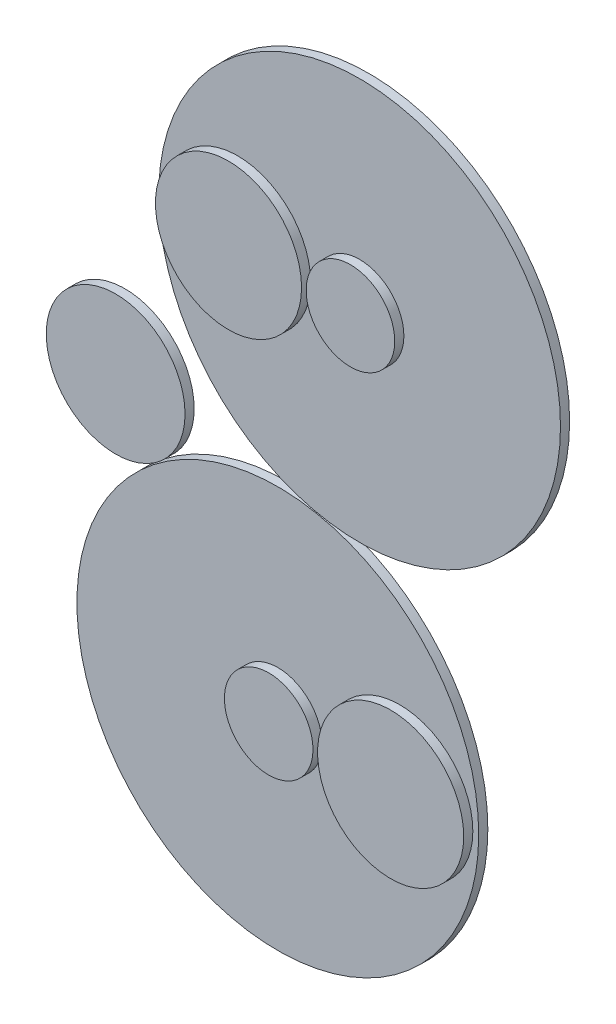
ISO-10303-21;
HEADER;
FILE_DESCRIPTION(('STEP AP214'),'2;1');
FILE_NAME('part.step','',(''),(''),'','','');
FILE_SCHEMA(('AUTOMOTIVE_DESIGN { 1 0 10303 214 1 1 1 1 }'));
ENDSEC;
DATA;
#1=APPLICATION_CONTEXT('core data for automotive mechanical design processes');
#2=APPLICATION_PROTOCOL_DEFINITION('international standard','automotive_design',2000,#1);
#3=PRODUCT_CONTEXT('',#1,'mechanical');
#4=PRODUCT('Part','Part','',(#3));
#5=PRODUCT_RELATED_PRODUCT_CATEGORY('part','',(#4));
#6=PRODUCT_DEFINITION_FORMATION('','',#4);
#7=PRODUCT_DEFINITION_CONTEXT('part definition',#1,'design');
#8=PRODUCT_DEFINITION('design','',#6,#7);
#9=PRODUCT_DEFINITION_SHAPE('','',#8);
#10=(LENGTH_UNIT() NAMED_UNIT(*) SI_UNIT(.MILLI.,.METRE.));
#11=(NAMED_UNIT(*) PLANE_ANGLE_UNIT() SI_UNIT($,.RADIAN.));
#12=(NAMED_UNIT(*) SI_UNIT($,.STERADIAN.) SOLID_ANGLE_UNIT());
#13=UNCERTAINTY_MEASURE_WITH_UNIT(LENGTH_MEASURE(1.E-05),#10,'distance_accuracy_value','');
#14=(GEOMETRIC_REPRESENTATION_CONTEXT(3) GLOBAL_UNCERTAINTY_ASSIGNED_CONTEXT((#13)) GLOBAL_UNIT_ASSIGNED_CONTEXT((#10,
#11,#12)) REPRESENTATION_CONTEXT('',''));
#15=CARTESIAN_POINT('',(0.,0.,0.));
#16=DIRECTION('',(0.,0.,1.));
#17=DIRECTION('',(1.,0.,0.));
#18=AXIS2_PLACEMENT_3D('',#15,#16,#17);
#19=CARTESIAN_POINT('',(-17.758926266195,23.8056828902649,1.));
#20=DIRECTION('',(0.,0.,-1.));
#21=DIRECTION('',(-1.,0.,0.));
#22=AXIS2_PLACEMENT_3D('',#19,#20,#21);
#23=CYLINDRICAL_SURFACE('',#22,7.6);
#24=CARTESIAN_POINT('',(-17.758926266195,23.8056828902649,1.));
#25=DIRECTION('',(0.,0.,1.));
#26=DIRECTION('',(1.,0.,0.));
#27=AXIS2_PLACEMENT_3D('',#24,#25,#26);
#28=CIRCLE('',#27,7.6);
#29=CARTESIAN_POINT('',(-10.158926266195,23.8056828902649,1.));
#30=VERTEX_POINT('',#29);
#31=EDGE_CURVE('E12',#30,#30,#28,.T.);
#32=ORIENTED_EDGE('',*,*,#31,.F.);
#33=EDGE_LOOP('',(#32));
#34=FACE_BOUND('',#33,.T.);
#35=CARTESIAN_POINT('',(-17.758926266195,23.8056828902649,0.));
#36=DIRECTION('',(0.,0.,1.));
#37=DIRECTION('',(1.,0.,0.));
#38=AXIS2_PLACEMENT_3D('',#35,#36,#37);
#39=CIRCLE('',#38,7.6);
#40=CARTESIAN_POINT('',(-10.158926266195,23.8056828902649,0.));
#41=VERTEX_POINT('',#40);
#42=EDGE_CURVE('E60',#41,#41,#39,.T.);
#43=ORIENTED_EDGE('',*,*,#42,.T.);
#44=EDGE_LOOP('',(#43));
#45=FACE_BOUND('',#44,.T.);
#46=ADVANCED_FACE('F57',(#34,#45),#23,.T.);
#47=CARTESIAN_POINT('',(4.47700000000001,-57.8908623119822,1.));
#48=DIRECTION('',(0.,0.,1.));
#49=DIRECTION('',(1.,0.,0.));
#50=AXIS2_PLACEMENT_3D('',#47,#48,#49);
#51=PLANE('',#50);
#52=ORIENTED_EDGE('',*,*,#31,.T.);
#53=EDGE_LOOP('',(#52));
#54=FACE_BOUND('',#53,.T.);
#55=ADVANCED_FACE('F72',(#54),#51,.T.);
#56=CARTESIAN_POINT('',(4.47700000000001,-57.8908623119822,0.));
#57=DIRECTION('',(0.,0.,1.));
#58=DIRECTION('',(1.,0.,0.));
#59=AXIS2_PLACEMENT_3D('',#56,#57,#58);
#60=PLANE('',#59);
#61=ORIENTED_EDGE('',*,*,#42,.F.);
#62=EDGE_LOOP('',(#61));
#63=FACE_BOUND('',#62,.T.);
#64=ADVANCED_FACE('F70',(#63),#60,.F.);
#65=CLOSED_SHELL('',(#46,#55,#64));
#66=MANIFOLD_SOLID_BREP('B2',#65);
#67=CARTESIAN_POINT('',(4.47700000000001,-57.8908623119822,1.));
#68=DIRECTION('',(0.,0.,1.));
#69=DIRECTION('',(1.,0.,0.));
#70=AXIS2_PLACEMENT_3D('',#67,#68,#69);
#71=PLANE('',#70);
#72=CARTESIAN_POINT('',(8.954,43.1814298512682,1.));
#73=DIRECTION('',(0.,0.,1.));
#74=DIRECTION('',(1.,0.,0.));
#75=AXIS2_PLACEMENT_3D('',#72,#73,#74);
#76=CIRCLE('',#75,4.85);
#77=CARTESIAN_POINT('',(13.804,43.1814298512682,1.));
#78=VERTEX_POINT('',#77);
#79=EDGE_CURVE('E117',#78,#78,#76,.T.);
#80=ORIENTED_EDGE('',*,*,#79,.F.);
#81=EDGE_LOOP('',(#80));
#82=FACE_BOUND('',#81,.T.);
#83=CARTESIAN_POINT('',(8.954,43.1814298512682,1.));
#84=DIRECTION('',(0.,0.,1.));
#85=DIRECTION('',(1.,0.,0.));
#86=AXIS2_PLACEMENT_3D('',#83,#84,#85);
#87=CIRCLE('',#86,22.);
#88=CARTESIAN_POINT('',(30.954,43.1814298512682,1.));
#89=VERTEX_POINT('',#88);
#90=EDGE_CURVE('E56',#89,#89,#87,.T.);
#91=ORIENTED_EDGE('',*,*,#90,.T.);
#92=EDGE_LOOP('',(#91));
#93=FACE_BOUND('',#92,.T.);
#94=CARTESIAN_POINT('',(-4.40099999999999,43.1814298512682,1.));
#95=DIRECTION('',(0.,0.,1.));
#96=DIRECTION('',(1.,0.,0.));
#97=AXIS2_PLACEMENT_3D('',#94,#95,#96);
#98=CIRCLE('',#97,8.);
#99=CARTESIAN_POINT('',(3.59900000000001,43.1814298512682,1.));
#100=VERTEX_POINT('',#99);
#101=EDGE_CURVE('E123',#100,#100,#98,.T.);
#102=ORIENTED_EDGE('',*,*,#101,.F.);
#103=EDGE_LOOP('',(#102));
#104=FACE_BOUND('',#103,.T.);
#105=ADVANCED_FACE('F104',(#82,#93,#104),#71,.T.);
#106=CARTESIAN_POINT('',(8.954,43.1814298512682,1.));
#107=DIRECTION('',(0.,0.,-1.));
#108=DIRECTION('',(-1.,0.,0.));
#109=AXIS2_PLACEMENT_3D('',#106,#107,#108);
#110=CYLINDRICAL_SURFACE('',#109,22.);
#111=ORIENTED_EDGE('',*,*,#90,.F.);
#112=EDGE_LOOP('',(#111));
#113=FACE_BOUND('',#112,.T.);
#114=CARTESIAN_POINT('',(8.954,43.1814298512682,0.));
#115=DIRECTION('',(0.,0.,1.));
#116=DIRECTION('',(1.,0.,0.));
#117=AXIS2_PLACEMENT_3D('',#114,#115,#116);
#118=CIRCLE('',#117,22.);
#119=CARTESIAN_POINT('',(30.954,43.1814298512682,0.));
#120=VERTEX_POINT('',#119);
#121=EDGE_CURVE('E108',#120,#120,#118,.T.);
#122=ORIENTED_EDGE('',*,*,#121,.T.);
#123=EDGE_LOOP('',(#122));
#124=FACE_BOUND('',#123,.T.);
#125=ADVANCED_FACE('F106',(#113,#124),#110,.T.);
#126=CARTESIAN_POINT('',(4.47700000000001,-57.8908623119822,0.));
#127=DIRECTION('',(0.,0.,1.));
#128=DIRECTION('',(1.,0.,0.));
#129=AXIS2_PLACEMENT_3D('',#126,#127,#128);
#130=PLANE('',#129);
#131=ORIENTED_EDGE('',*,*,#121,.F.);
#132=EDGE_LOOP('',(#131));
#133=FACE_BOUND('',#132,.T.);
#134=ADVANCED_FACE('F144',(#133),#130,.F.);
#135=CARTESIAN_POINT('',(8.954,43.1814298512682,2.));
#136=DIRECTION('',(0.,0.,-1.));
#137=DIRECTION('',(-1.,0.,0.));
#138=AXIS2_PLACEMENT_3D('',#135,#136,#137);
#139=CYLINDRICAL_SURFACE('',#138,4.85);
#140=CARTESIAN_POINT('',(8.954,43.1814298512682,2.));
#141=DIRECTION('',(0.,0.,1.));
#142=DIRECTION('',(1.,0.,0.));
#143=AXIS2_PLACEMENT_3D('',#140,#141,#142);
#144=CIRCLE('',#143,4.85);
#145=CARTESIAN_POINT('',(13.804,43.1814298512682,2.));
#146=VERTEX_POINT('',#145);
#147=EDGE_CURVE('E115',#146,#146,#144,.T.);
#148=ORIENTED_EDGE('',*,*,#147,.F.);
#149=EDGE_LOOP('',(#148));
#150=FACE_BOUND('',#149,.T.);
#151=ORIENTED_EDGE('',*,*,#79,.T.);
#152=EDGE_LOOP('',(#151));
#153=FACE_BOUND('',#152,.T.);
#154=ADVANCED_FACE('F148',(#150,#153),#139,.T.);
#155=CARTESIAN_POINT('',(8.954,43.1814298512682,2.));
#156=DIRECTION('',(0.,0.,1.));
#157=DIRECTION('',(1.,0.,0.));
#158=AXIS2_PLACEMENT_3D('',#155,#156,#157);
#159=PLANE('',#158);
#160=ORIENTED_EDGE('',*,*,#147,.T.);
#161=EDGE_LOOP('',(#160));
#162=FACE_BOUND('',#161,.T.);
#163=ADVANCED_FACE('F134',(#162),#159,.T.);
#164=CARTESIAN_POINT('',(-4.40099999999999,43.1814298512682,2.));
#165=DIRECTION('',(0.,0.,-1.));
#166=DIRECTION('',(-1.,0.,0.));
#167=AXIS2_PLACEMENT_3D('',#164,#165,#166);
#168=CYLINDRICAL_SURFACE('',#167,8.);
#169=CARTESIAN_POINT('',(-4.40099999999999,43.1814298512682,2.));
#170=DIRECTION('',(0.,0.,1.));
#171=DIRECTION('',(1.,0.,0.));
#172=AXIS2_PLACEMENT_3D('',#169,#170,#171);
#173=CIRCLE('',#172,8.);
#174=CARTESIAN_POINT('',(3.59900000000001,43.1814298512682,2.));
#175=VERTEX_POINT('',#174);
#176=EDGE_CURVE('E120',#175,#175,#173,.T.);
#177=ORIENTED_EDGE('',*,*,#176,.F.);
#178=EDGE_LOOP('',(#177));
#179=FACE_BOUND('',#178,.T.);
#180=ORIENTED_EDGE('',*,*,#101,.T.);
#181=EDGE_LOOP('',(#180));
#182=FACE_BOUND('',#181,.T.);
#183=ADVANCED_FACE('F131',(#179,#182),#168,.T.);
#184=CARTESIAN_POINT('',(-4.40099999999999,43.1814298512682,2.));
#185=DIRECTION('',(0.,0.,1.));
#186=DIRECTION('',(1.,0.,0.));
#187=AXIS2_PLACEMENT_3D('',#184,#185,#186);
#188=PLANE('',#187);
#189=ORIENTED_EDGE('',*,*,#176,.T.);
#190=EDGE_LOOP('',(#189));
#191=FACE_BOUND('',#190,.T.);
#192=ADVANCED_FACE('F129',(#191),#188,.T.);
#193=CLOSED_SHELL('',(#105,#125,#134,#154,#163,#183,#192));
#194=MANIFOLD_SOLID_BREP('B7',#193);
#195=CARTESIAN_POINT('',(4.47700000000001,-57.8908623119822,1.));
#196=DIRECTION('',(0.,0.,1.));
#197=DIRECTION('',(1.,0.,0.));
#198=AXIS2_PLACEMENT_3D('',#195,#196,#197);
#199=PLANE('',#198);
#200=CARTESIAN_POINT('',(0.,0.,1.));
#201=DIRECTION('',(0.,0.,1.));
#202=DIRECTION('',(1.,0.,0.));
#203=AXIS2_PLACEMENT_3D('',#200,#201,#202);
#204=CIRCLE('',#203,4.85);
#205=CARTESIAN_POINT('',(4.85,0.,1.));
#206=VERTEX_POINT('',#205);
#207=EDGE_CURVE('E217',#206,#206,#204,.T.);
#208=ORIENTED_EDGE('',*,*,#207,.F.);
#209=EDGE_LOOP('',(#208));
#210=FACE_BOUND('',#209,.T.);
#211=CARTESIAN_POINT('',(0.,0.,1.));
#212=DIRECTION('',(0.,0.,1.));
#213=DIRECTION('',(1.,0.,0.));
#214=AXIS2_PLACEMENT_3D('',#211,#212,#213);
#215=CIRCLE('',#214,22.);
#216=CARTESIAN_POINT('',(22.,0.,1.));
#217=VERTEX_POINT('',#216);
#218=EDGE_CURVE('E103',#217,#217,#215,.T.);
#219=ORIENTED_EDGE('',*,*,#218,.T.);
#220=EDGE_LOOP('',(#219));
#221=FACE_BOUND('',#220,.T.);
#222=CARTESIAN_POINT('',(13.355,0.,1.));
#223=DIRECTION('',(0.,0.,1.));
#224=DIRECTION('',(1.,0.,0.));
#225=AXIS2_PLACEMENT_3D('',#222,#223,#224);
#226=CIRCLE('',#225,8.);
#227=CARTESIAN_POINT('',(21.355,0.,1.));
#228=VERTEX_POINT('',#227);
#229=EDGE_CURVE('E223',#228,#228,#226,.T.);
#230=ORIENTED_EDGE('',*,*,#229,.F.);
#231=EDGE_LOOP('',(#230));
#232=FACE_BOUND('',#231,.T.);
#233=ADVANCED_FACE('F204',(#210,#221,#232),#199,.T.);
#234=CARTESIAN_POINT('',(0.,0.,1.));
#235=DIRECTION('',(0.,0.,-1.));
#236=DIRECTION('',(-1.,0.,0.));
#237=AXIS2_PLACEMENT_3D('',#234,#235,#236);
#238=CYLINDRICAL_SURFACE('',#237,22.);
#239=ORIENTED_EDGE('',*,*,#218,.F.);
#240=EDGE_LOOP('',(#239));
#241=FACE_BOUND('',#240,.T.);
#242=CARTESIAN_POINT('',(0.,0.,0.));
#243=DIRECTION('',(0.,0.,1.));
#244=DIRECTION('',(1.,0.,0.));
#245=AXIS2_PLACEMENT_3D('',#242,#243,#244);
#246=CIRCLE('',#245,22.);
#247=CARTESIAN_POINT('',(22.,0.,0.));
#248=VERTEX_POINT('',#247);
#249=EDGE_CURVE('E208',#248,#248,#246,.T.);
#250=ORIENTED_EDGE('',*,*,#249,.T.);
#251=EDGE_LOOP('',(#250));
#252=FACE_BOUND('',#251,.T.);
#253=ADVANCED_FACE('F206',(#241,#252),#238,.T.);
#254=CARTESIAN_POINT('',(4.47700000000001,-57.8908623119822,0.));
#255=DIRECTION('',(0.,0.,1.));
#256=DIRECTION('',(1.,0.,0.));
#257=AXIS2_PLACEMENT_3D('',#254,#255,#256);
#258=PLANE('',#257);
#259=ORIENTED_EDGE('',*,*,#249,.F.);
#260=EDGE_LOOP('',(#259));
#261=FACE_BOUND('',#260,.T.);
#262=ADVANCED_FACE('F244',(#261),#258,.F.);
#263=CARTESIAN_POINT('',(0.,0.,2.));
#264=DIRECTION('',(0.,0.,-1.));
#265=DIRECTION('',(-1.,0.,0.));
#266=AXIS2_PLACEMENT_3D('',#263,#264,#265);
#267=CYLINDRICAL_SURFACE('',#266,4.85);
#268=CARTESIAN_POINT('',(0.,0.,2.));
#269=DIRECTION('',(0.,0.,1.));
#270=DIRECTION('',(1.,0.,0.));
#271=AXIS2_PLACEMENT_3D('',#268,#269,#270);
#272=CIRCLE('',#271,4.85);
#273=CARTESIAN_POINT('',(4.85,0.,2.));
#274=VERTEX_POINT('',#273);
#275=EDGE_CURVE('E215',#274,#274,#272,.T.);
#276=ORIENTED_EDGE('',*,*,#275,.F.);
#277=EDGE_LOOP('',(#276));
#278=FACE_BOUND('',#277,.T.);
#279=ORIENTED_EDGE('',*,*,#207,.T.);
#280=EDGE_LOOP('',(#279));
#281=FACE_BOUND('',#280,.T.);
#282=ADVANCED_FACE('F248',(#278,#281),#267,.T.);
#283=CARTESIAN_POINT('',(0.,0.,2.));
#284=DIRECTION('',(0.,0.,1.));
#285=DIRECTION('',(1.,0.,0.));
#286=AXIS2_PLACEMENT_3D('',#283,#284,#285);
#287=PLANE('',#286);
#288=ORIENTED_EDGE('',*,*,#275,.T.);
#289=EDGE_LOOP('',(#288));
#290=FACE_BOUND('',#289,.T.);
#291=ADVANCED_FACE('F234',(#290),#287,.T.);
#292=CARTESIAN_POINT('',(13.355,0.,2.));
#293=DIRECTION('',(0.,0.,-1.));
#294=DIRECTION('',(-1.,0.,0.));
#295=AXIS2_PLACEMENT_3D('',#292,#293,#294);
#296=CYLINDRICAL_SURFACE('',#295,8.);
#297=CARTESIAN_POINT('',(13.355,0.,2.));
#298=DIRECTION('',(0.,0.,1.));
#299=DIRECTION('',(1.,0.,0.));
#300=AXIS2_PLACEMENT_3D('',#297,#298,#299);
#301=CIRCLE('',#300,8.);
#302=CARTESIAN_POINT('',(21.355,0.,2.));
#303=VERTEX_POINT('',#302);
#304=EDGE_CURVE('E220',#303,#303,#301,.T.);
#305=ORIENTED_EDGE('',*,*,#304,.F.);
#306=EDGE_LOOP('',(#305));
#307=FACE_BOUND('',#306,.T.);
#308=ORIENTED_EDGE('',*,*,#229,.T.);
#309=EDGE_LOOP('',(#308));
#310=FACE_BOUND('',#309,.T.);
#311=ADVANCED_FACE('F231',(#307,#310),#296,.T.);
#312=CARTESIAN_POINT('',(13.355,0.,2.));
#313=DIRECTION('',(0.,0.,1.));
#314=DIRECTION('',(1.,0.,0.));
#315=AXIS2_PLACEMENT_3D('',#312,#313,#314);
#316=PLANE('',#315);
#317=ORIENTED_EDGE('',*,*,#304,.T.);
#318=EDGE_LOOP('',(#317));
#319=FACE_BOUND('',#318,.T.);
#320=ADVANCED_FACE('F229',(#319),#316,.T.);
#321=CLOSED_SHELL('',(#233,#253,#262,#282,#291,#311,#320));
#322=MANIFOLD_SOLID_BREP('B51',#321);
#323=ADVANCED_BREP_SHAPE_REPRESENTATION('',(#18,#66,#194,#322),#14);
#324=SHAPE_DEFINITION_REPRESENTATION(#9,#323);
ENDSEC;
END-ISO-10303-21;
